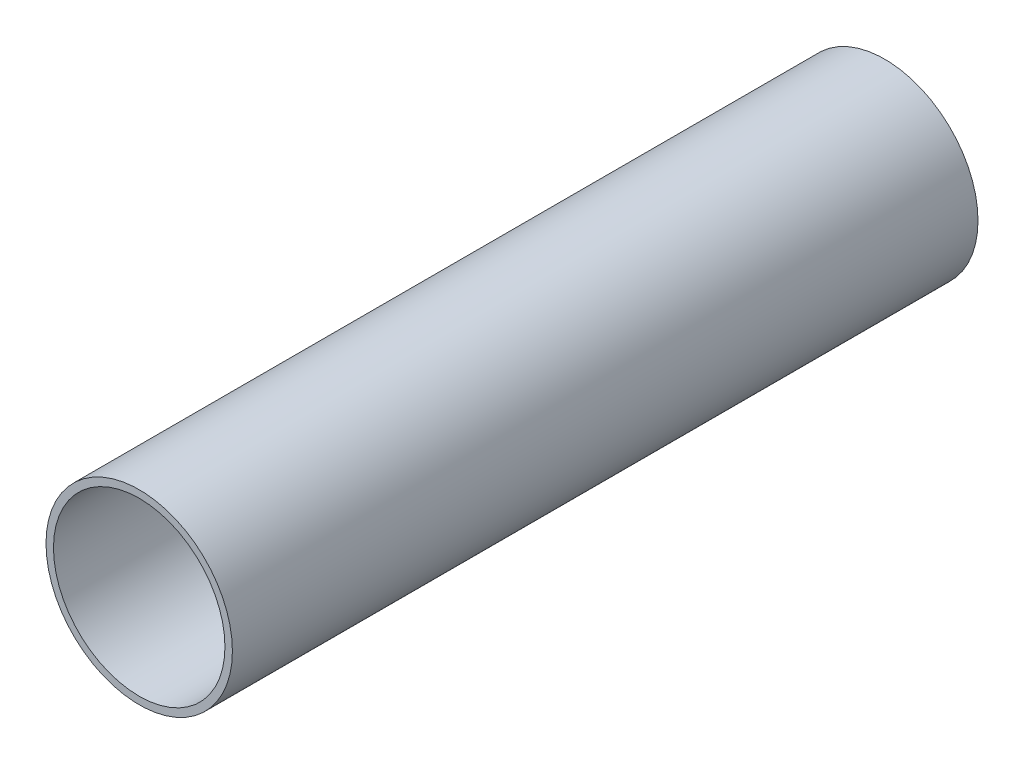
ISO-10303-21;
HEADER;
FILE_DESCRIPTION(('STEP AP214'),'2;1');
FILE_NAME('part.step','',(''),(''),'','','');
FILE_SCHEMA(('AUTOMOTIVE_DESIGN { 1 0 10303 214 1 1 1 1 }'));
ENDSEC;
DATA;
#1=APPLICATION_CONTEXT('core data for automotive mechanical design processes');
#2=APPLICATION_PROTOCOL_DEFINITION('international standard','automotive_design',2000,#1);
#3=PRODUCT_CONTEXT('',#1,'mechanical');
#4=PRODUCT('Part','Part','',(#3));
#5=PRODUCT_RELATED_PRODUCT_CATEGORY('part','',(#4));
#6=PRODUCT_DEFINITION_FORMATION('','',#4);
#7=PRODUCT_DEFINITION_CONTEXT('part definition',#1,'design');
#8=PRODUCT_DEFINITION('design','',#6,#7);
#9=PRODUCT_DEFINITION_SHAPE('','',#8);
#10=(LENGTH_UNIT() NAMED_UNIT(*) SI_UNIT(.MILLI.,.METRE.));
#11=(NAMED_UNIT(*) PLANE_ANGLE_UNIT() SI_UNIT($,.RADIAN.));
#12=(NAMED_UNIT(*) SI_UNIT($,.STERADIAN.) SOLID_ANGLE_UNIT());
#13=UNCERTAINTY_MEASURE_WITH_UNIT(LENGTH_MEASURE(1.E-05),#10,'distance_accuracy_value','');
#14=(GEOMETRIC_REPRESENTATION_CONTEXT(3) GLOBAL_UNCERTAINTY_ASSIGNED_CONTEXT((#13)) GLOBAL_UNIT_ASSIGNED_CONTEXT((#10,
#11,#12)) REPRESENTATION_CONTEXT('',''));
#15=CARTESIAN_POINT('',(0.,0.,0.));
#16=DIRECTION('',(0.,0.,1.));
#17=DIRECTION('',(1.,0.,0.));
#18=AXIS2_PLACEMENT_3D('',#15,#16,#17);
#19=CARTESIAN_POINT('',(0.,0.,200.));
#20=DIRECTION('',(0.,0.,1.));
#21=DIRECTION('',(1.,0.,0.));
#22=AXIS2_PLACEMENT_3D('',#19,#20,#21);
#23=PLANE('',#22);
#24=CARTESIAN_POINT('',(0.,0.,200.));
#25=DIRECTION('',(0.,0.,1.));
#26=DIRECTION('',(1.,0.,0.));
#27=AXIS2_PLACEMENT_3D('',#24,#25,#26);
#28=CIRCLE('',#27,25.);
#29=CARTESIAN_POINT('',(25.,0.,200.));
#30=VERTEX_POINT('',#29);
#31=EDGE_CURVE('E10',#30,#30,#28,.T.);
#32=ORIENTED_EDGE('',*,*,#31,.T.);
#33=EDGE_LOOP('',(#32));
#34=FACE_BOUND('',#33,.T.);
#35=CARTESIAN_POINT('',(0.,0.,200.));
#36=DIRECTION('',(0.,0.,1.));
#37=DIRECTION('',(1.,0.,0.));
#38=AXIS2_PLACEMENT_3D('',#35,#36,#37);
#39=CIRCLE('',#38,23.);
#40=CARTESIAN_POINT('',(23.,0.,200.));
#41=VERTEX_POINT('',#40);
#42=EDGE_CURVE('E43',#41,#41,#39,.T.);
#43=ORIENTED_EDGE('',*,*,#42,.F.);
#44=EDGE_LOOP('',(#43));
#45=FACE_BOUND('',#44,.T.);
#46=ADVANCED_FACE('F32',(#34,#45),#23,.T.);
#47=CARTESIAN_POINT('',(0.,0.,0.));
#48=DIRECTION('',(0.,0.,1.));
#49=DIRECTION('',(1.,0.,0.));
#50=AXIS2_PLACEMENT_3D('',#47,#48,#49);
#51=PLANE('',#50);
#52=CARTESIAN_POINT('',(0.,0.,0.));
#53=DIRECTION('',(0.,0.,1.));
#54=DIRECTION('',(1.,0.,0.));
#55=AXIS2_PLACEMENT_3D('',#52,#53,#54);
#56=CIRCLE('',#55,25.);
#57=CARTESIAN_POINT('',(25.,0.,0.));
#58=VERTEX_POINT('',#57);
#59=EDGE_CURVE('E36',#58,#58,#56,.T.);
#60=ORIENTED_EDGE('',*,*,#59,.F.);
#61=EDGE_LOOP('',(#60));
#62=FACE_BOUND('',#61,.T.);
#63=CARTESIAN_POINT('',(0.,0.,0.));
#64=DIRECTION('',(0.,0.,1.));
#65=DIRECTION('',(1.,0.,0.));
#66=AXIS2_PLACEMENT_3D('',#63,#64,#65);
#67=CIRCLE('',#66,23.);
#68=CARTESIAN_POINT('',(23.,0.,0.));
#69=VERTEX_POINT('',#68);
#70=EDGE_CURVE('E45',#69,#69,#67,.T.);
#71=ORIENTED_EDGE('',*,*,#70,.T.);
#72=EDGE_LOOP('',(#71));
#73=FACE_BOUND('',#72,.T.);
#74=ADVANCED_FACE('F55',(#62,#73),#51,.F.);
#75=CARTESIAN_POINT('',(0.,0.,200.));
#76=DIRECTION('',(0.,0.,-1.));
#77=DIRECTION('',(-1.,0.,0.));
#78=AXIS2_PLACEMENT_3D('',#75,#76,#77);
#79=CYLINDRICAL_SURFACE('',#78,25.);
#80=ORIENTED_EDGE('',*,*,#31,.F.);
#81=EDGE_LOOP('',(#80));
#82=FACE_BOUND('',#81,.T.);
#83=ORIENTED_EDGE('',*,*,#59,.T.);
#84=EDGE_LOOP('',(#83));
#85=FACE_BOUND('',#84,.T.);
#86=ADVANCED_FACE('F34',(#82,#85),#79,.T.);
#87=CARTESIAN_POINT('',(0.,0.,200.));
#88=DIRECTION('',(0.,0.,-1.));
#89=DIRECTION('',(-1.,0.,0.));
#90=AXIS2_PLACEMENT_3D('',#87,#88,#89);
#91=CYLINDRICAL_SURFACE('',#90,23.);
#92=ORIENTED_EDGE('',*,*,#42,.T.);
#93=EDGE_LOOP('',(#92));
#94=FACE_BOUND('',#93,.T.);
#95=ORIENTED_EDGE('',*,*,#70,.F.);
#96=EDGE_LOOP('',(#95));
#97=FACE_BOUND('',#96,.T.);
#98=ADVANCED_FACE('F51',(#94,#97),#91,.F.);
#99=CLOSED_SHELL('',(#46,#74,#86,#98));
#100=MANIFOLD_SOLID_BREP('B2',#99);
#101=ADVANCED_BREP_SHAPE_REPRESENTATION('',(#18,#100),#14);
#102=SHAPE_DEFINITION_REPRESENTATION(#9,#101);
ENDSEC;
END-ISO-10303-21;
